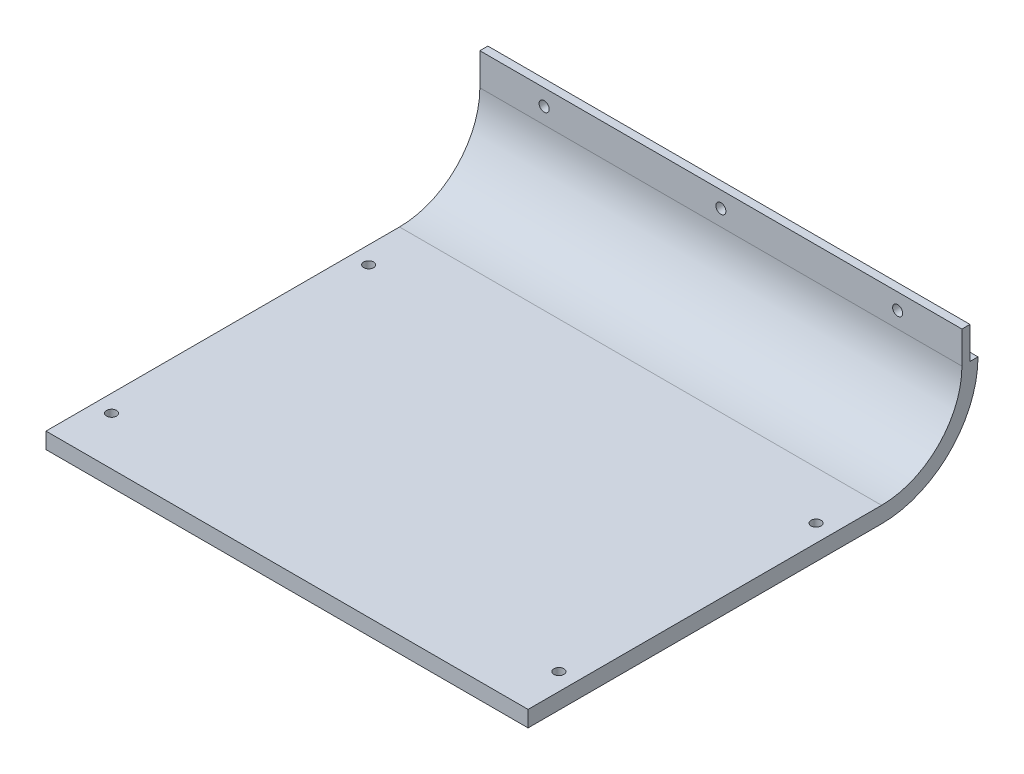
ISO-10303-21;
HEADER;
FILE_DESCRIPTION(('STEP AP214'),'2;1');
FILE_NAME('part.step','',(''),(''),'','','');
FILE_SCHEMA(('AUTOMOTIVE_DESIGN { 1 0 10303 214 1 1 1 1 }'));
ENDSEC;
DATA;
#1=APPLICATION_CONTEXT('core data for automotive mechanical design processes');
#2=APPLICATION_PROTOCOL_DEFINITION('international standard','automotive_design',2000,#1);
#3=PRODUCT_CONTEXT('',#1,'mechanical');
#4=PRODUCT('Part','Part','',(#3));
#5=PRODUCT_RELATED_PRODUCT_CATEGORY('part','',(#4));
#6=PRODUCT_DEFINITION_FORMATION('','',#4);
#7=PRODUCT_DEFINITION_CONTEXT('part definition',#1,'design');
#8=PRODUCT_DEFINITION('design','',#6,#7);
#9=PRODUCT_DEFINITION_SHAPE('','',#8);
#10=(LENGTH_UNIT() NAMED_UNIT(*) SI_UNIT(.MILLI.,.METRE.));
#11=(NAMED_UNIT(*) PLANE_ANGLE_UNIT() SI_UNIT($,.RADIAN.));
#12=(NAMED_UNIT(*) SI_UNIT($,.STERADIAN.) SOLID_ANGLE_UNIT());
#13=UNCERTAINTY_MEASURE_WITH_UNIT(LENGTH_MEASURE(1.E-05),#10,'distance_accuracy_value','');
#14=(GEOMETRIC_REPRESENTATION_CONTEXT(3) GLOBAL_UNCERTAINTY_ASSIGNED_CONTEXT((#13)) GLOBAL_UNIT_ASSIGNED_CONTEXT((#10,
#11,#12)) REPRESENTATION_CONTEXT('',''));
#15=CARTESIAN_POINT('',(0.,0.,0.));
#16=DIRECTION('',(0.,0.,1.));
#17=DIRECTION('',(1.,0.,0.));
#18=AXIS2_PLACEMENT_3D('',#15,#16,#17);
#19=CARTESIAN_POINT('',(-190.5,76.2,-139.7));
#20=DIRECTION('',(1.,0.,0.));
#21=DIRECTION('',(0.,0.,-1.));
#22=AXIS2_PLACEMENT_3D('',#19,#20,#21);
#23=CYLINDRICAL_SURFACE('',#22,76.2);
#24=DIRECTION('',(1.,0.,0.));
#25=VECTOR('',#24,1.);
#26=CARTESIAN_POINT('',(-190.5,76.2,-215.9));
#27=LINE('',#26,#25);
#28=CARTESIAN_POINT('',(-190.5,76.2,-215.9));
#29=VERTEX_POINT('',#28);
#30=CARTESIAN_POINT('',(190.5,76.2,-215.9));
#31=VERTEX_POINT('',#30);
#32=EDGE_CURVE('E61',#29,#31,#27,.T.);
#33=ORIENTED_EDGE('',*,*,#32,.T.);
#34=CARTESIAN_POINT('',(190.5,76.2,-139.7));
#35=DIRECTION('',(1.,0.,0.));
#36=DIRECTION('',(0.,0.,1.));
#37=AXIS2_PLACEMENT_3D('',#34,#35,#36);
#38=CIRCLE('',#37,76.2);
#39=CARTESIAN_POINT('',(190.5,0.,-139.7));
#40=VERTEX_POINT('',#39);
#41=EDGE_CURVE('E160',#40,#31,#38,.T.);
#42=ORIENTED_EDGE('',*,*,#41,.F.);
#43=DIRECTION('',(1.,0.,0.));
#44=VECTOR('',#43,1.);
#45=CARTESIAN_POINT('',(-190.5,0.,-139.7));
#46=LINE('',#45,#44);
#47=CARTESIAN_POINT('',(-190.5,0.,-139.7));
#48=VERTEX_POINT('',#47);
#49=EDGE_CURVE('E13',#48,#40,#46,.T.);
#50=ORIENTED_EDGE('',*,*,#49,.F.);
#51=CARTESIAN_POINT('',(-190.5,76.2,-139.7));
#52=DIRECTION('',(1.,0.,0.));
#53=DIRECTION('',(0.,0.,1.));
#54=AXIS2_PLACEMENT_3D('',#51,#52,#53);
#55=CIRCLE('',#54,76.2);
#56=EDGE_CURVE('E190',#48,#29,#55,.T.);
#57=ORIENTED_EDGE('',*,*,#56,.T.);
#58=EDGE_LOOP('',(#33,#42,#50,#57));
#59=FACE_BOUND('',#58,.T.);
#60=ADVANCED_FACE('F58',(#59),#23,.T.);
#61=CARTESIAN_POINT('',(-190.5,0.,139.7));
#62=DIRECTION('',(0.,-1.,0.));
#63=DIRECTION('',(0.,0.,-1.));
#64=AXIS2_PLACEMENT_3D('',#61,#62,#63);
#65=PLANE('',#64);
#66=CARTESIAN_POINT('',(176.784,0.,-101.6));
#67=DIRECTION('',(0.,1.,0.));
#68=DIRECTION('',(0.,0.,1.));
#69=AXIS2_PLACEMENT_3D('',#66,#67,#68);
#70=CIRCLE('',#69,3.937);
#71=CARTESIAN_POINT('',(176.784,0.,-97.6630000000001));
#72=VERTEX_POINT('',#71);
#73=EDGE_CURVE('E297',#72,#72,#70,.T.);
#74=ORIENTED_EDGE('',*,*,#73,.T.);
#75=EDGE_LOOP('',(#74));
#76=FACE_BOUND('',#75,.T.);
#77=CARTESIAN_POINT('',(-176.784,0.,101.6));
#78=DIRECTION('',(0.,1.,0.));
#79=DIRECTION('',(0.,0.,-1.));
#80=AXIS2_PLACEMENT_3D('',#77,#78,#79);
#81=CIRCLE('',#80,3.937);
#82=CARTESIAN_POINT('',(-176.784,0.,97.663));
#83=VERTEX_POINT('',#82);
#84=EDGE_CURVE('E288',#83,#83,#81,.T.);
#85=ORIENTED_EDGE('',*,*,#84,.T.);
#86=EDGE_LOOP('',(#85));
#87=FACE_BOUND('',#86,.T.);
#88=CARTESIAN_POINT('',(-176.784,0.,-101.6));
#89=DIRECTION('',(0.,1.,0.));
#90=DIRECTION('',(0.,0.,-1.));
#91=AXIS2_PLACEMENT_3D('',#88,#89,#90);
#92=CIRCLE('',#91,3.937);
#93=CARTESIAN_POINT('',(-176.784,0.,-105.537));
#94=VERTEX_POINT('',#93);
#95=EDGE_CURVE('E304',#94,#94,#92,.T.);
#96=ORIENTED_EDGE('',*,*,#95,.T.);
#97=EDGE_LOOP('',(#96));
#98=FACE_BOUND('',#97,.T.);
#99=CARTESIAN_POINT('',(176.784,0.,101.6));
#100=DIRECTION('',(0.,1.,0.));
#101=DIRECTION('',(0.,0.,1.));
#102=AXIS2_PLACEMENT_3D('',#99,#100,#101);
#103=CIRCLE('',#102,3.937);
#104=CARTESIAN_POINT('',(176.784,0.,105.537));
#105=VERTEX_POINT('',#104);
#106=EDGE_CURVE('E273',#105,#105,#103,.T.);
#107=ORIENTED_EDGE('',*,*,#106,.T.);
#108=EDGE_LOOP('',(#107));
#109=FACE_BOUND('',#108,.T.);
#110=ORIENTED_EDGE('',*,*,#49,.T.);
#111=DIRECTION('',(0.,0.,-1.));
#112=VECTOR('',#111,1.);
#113=CARTESIAN_POINT('',(190.5,0.,139.7));
#114=LINE('',#113,#112);
#115=CARTESIAN_POINT('',(190.5,0.,139.7));
#116=VERTEX_POINT('',#115);
#117=EDGE_CURVE('E186',#116,#40,#114,.T.);
#118=ORIENTED_EDGE('',*,*,#117,.F.);
#119=DIRECTION('',(1.,0.,0.));
#120=VECTOR('',#119,1.);
#121=CARTESIAN_POINT('',(-190.5,0.,139.7));
#122=LINE('',#121,#120);
#123=CARTESIAN_POINT('',(-190.5,0.,139.7));
#124=VERTEX_POINT('',#123);
#125=EDGE_CURVE('E67',#124,#116,#122,.T.);
#126=ORIENTED_EDGE('',*,*,#125,.F.);
#127=DIRECTION('',(0.,0.,-1.));
#128=VECTOR('',#127,1.);
#129=CARTESIAN_POINT('',(-190.5,0.,139.7));
#130=LINE('',#129,#128);
#131=EDGE_CURVE('E206',#124,#48,#130,.T.);
#132=ORIENTED_EDGE('',*,*,#131,.T.);
#133=EDGE_LOOP('',(#110,#118,#126,#132));
#134=FACE_BOUND('',#133,.T.);
#135=ADVANCED_FACE('F231',(#76,#87,#98,#109,#134),#65,.T.);
#136=CARTESIAN_POINT('',(-190.5,0.,139.7));
#137=DIRECTION('',(0.,0.,1.));
#138=DIRECTION('',(1.,0.,0.));
#139=AXIS2_PLACEMENT_3D('',#136,#137,#138);
#140=PLANE('',#139);
#141=ORIENTED_EDGE('',*,*,#125,.T.);
#142=DIRECTION('',(0.,-1.,0.));
#143=VECTOR('',#142,1.);
#144=CARTESIAN_POINT('',(190.5,0.,139.7));
#145=LINE('',#144,#143);
#146=CARTESIAN_POINT('',(190.5,12.7,139.7));
#147=VERTEX_POINT('',#146);
#148=EDGE_CURVE('E182',#147,#116,#145,.T.);
#149=ORIENTED_EDGE('',*,*,#148,.F.);
#150=DIRECTION('',(1.,0.,0.));
#151=VECTOR('',#150,1.);
#152=CARTESIAN_POINT('',(-190.5,12.7,139.7));
#153=LINE('',#152,#151);
#154=CARTESIAN_POINT('',(-190.5,12.7,139.7));
#155=VERTEX_POINT('',#154);
#156=EDGE_CURVE('E212',#155,#147,#153,.T.);
#157=ORIENTED_EDGE('',*,*,#156,.F.);
#158=DIRECTION('',(0.,-1.,0.));
#159=VECTOR('',#158,1.);
#160=CARTESIAN_POINT('',(-190.5,0.,139.7));
#161=LINE('',#160,#159);
#162=EDGE_CURVE('E202',#155,#124,#161,.T.);
#163=ORIENTED_EDGE('',*,*,#162,.T.);
#164=EDGE_LOOP('',(#141,#149,#157,#163));
#165=FACE_BOUND('',#164,.T.);
#166=ADVANCED_FACE('F319',(#165),#140,.T.);
#167=CARTESIAN_POINT('',(-190.5,12.7,139.7));
#168=DIRECTION('',(0.,1.,0.));
#169=DIRECTION('',(0.,0.,1.));
#170=AXIS2_PLACEMENT_3D('',#167,#168,#169);
#171=PLANE('',#170);
#172=CARTESIAN_POINT('',(176.784,12.7,-101.6));
#173=DIRECTION('',(0.,1.,0.));
#174=DIRECTION('',(0.,0.,1.));
#175=AXIS2_PLACEMENT_3D('',#172,#173,#174);
#176=CIRCLE('',#175,3.937);
#177=CARTESIAN_POINT('',(176.784,12.7,-97.6630000000001));
#178=VERTEX_POINT('',#177);
#179=EDGE_CURVE('E284',#178,#178,#176,.T.);
#180=ORIENTED_EDGE('',*,*,#179,.F.);
#181=EDGE_LOOP('',(#180));
#182=FACE_BOUND('',#181,.T.);
#183=CARTESIAN_POINT('',(-176.784,12.7,101.6));
#184=DIRECTION('',(0.,1.,0.));
#185=DIRECTION('',(0.,0.,-1.));
#186=AXIS2_PLACEMENT_3D('',#183,#184,#185);
#187=CIRCLE('',#186,3.937);
#188=CARTESIAN_POINT('',(-176.784,12.7,97.663));
#189=VERTEX_POINT('',#188);
#190=EDGE_CURVE('E292',#189,#189,#187,.T.);
#191=ORIENTED_EDGE('',*,*,#190,.F.);
#192=EDGE_LOOP('',(#191));
#193=FACE_BOUND('',#192,.T.);
#194=CARTESIAN_POINT('',(-176.784,12.7,-101.6));
#195=DIRECTION('',(0.,1.,0.));
#196=DIRECTION('',(0.,0.,-1.));
#197=AXIS2_PLACEMENT_3D('',#194,#195,#196);
#198=CIRCLE('',#197,3.937);
#199=CARTESIAN_POINT('',(-176.784,12.7,-105.537));
#200=VERTEX_POINT('',#199);
#201=EDGE_CURVE('E293',#200,#200,#198,.T.);
#202=ORIENTED_EDGE('',*,*,#201,.F.);
#203=EDGE_LOOP('',(#202));
#204=FACE_BOUND('',#203,.T.);
#205=CARTESIAN_POINT('',(176.784,12.7,101.6));
#206=DIRECTION('',(0.,1.,0.));
#207=DIRECTION('',(0.,0.,1.));
#208=AXIS2_PLACEMENT_3D('',#205,#206,#207);
#209=CIRCLE('',#208,3.937);
#210=CARTESIAN_POINT('',(176.784,12.7,105.537));
#211=VERTEX_POINT('',#210);
#212=EDGE_CURVE('E280',#211,#211,#209,.T.);
#213=ORIENTED_EDGE('',*,*,#212,.F.);
#214=EDGE_LOOP('',(#213));
#215=FACE_BOUND('',#214,.T.);
#216=ORIENTED_EDGE('',*,*,#156,.T.);
#217=DIRECTION('',(0.,0.,1.));
#218=VECTOR('',#217,1.);
#219=CARTESIAN_POINT('',(190.5,12.7,139.7));
#220=LINE('',#219,#218);
#221=CARTESIAN_POINT('',(190.5,12.7,-139.7));
#222=VERTEX_POINT('',#221);
#223=EDGE_CURVE('E178',#222,#147,#220,.T.);
#224=ORIENTED_EDGE('',*,*,#223,.F.);
#225=DIRECTION('',(1.,0.,0.));
#226=VECTOR('',#225,1.);
#227=CARTESIAN_POINT('',(-190.5,12.7,-139.7));
#228=LINE('',#227,#226);
#229=CARTESIAN_POINT('',(-190.5,12.7,-139.7));
#230=VERTEX_POINT('',#229);
#231=EDGE_CURVE('E215',#230,#222,#228,.T.);
#232=ORIENTED_EDGE('',*,*,#231,.F.);
#233=DIRECTION('',(0.,0.,1.));
#234=VECTOR('',#233,1.);
#235=CARTESIAN_POINT('',(-190.5,12.7,139.7));
#236=LINE('',#235,#234);
#237=EDGE_CURVE('E198',#230,#155,#236,.T.);
#238=ORIENTED_EDGE('',*,*,#237,.T.);
#239=EDGE_LOOP('',(#216,#224,#232,#238));
#240=FACE_BOUND('',#239,.T.);
#241=ADVANCED_FACE('F315',(#182,#193,#204,#215,#240),#171,.T.);
#242=CARTESIAN_POINT('',(-190.5,76.2,-139.7));
#243=DIRECTION('',(1.,0.,0.));
#244=DIRECTION('',(0.,0.,-1.));
#245=AXIS2_PLACEMENT_3D('',#242,#243,#244);
#246=CYLINDRICAL_SURFACE('',#245,63.5);
#247=ORIENTED_EDGE('',*,*,#231,.T.);
#248=CARTESIAN_POINT('',(190.5,76.2,-139.7));
#249=DIRECTION('',(-1.,0.,0.));
#250=DIRECTION('',(0.,0.,1.));
#251=AXIS2_PLACEMENT_3D('',#248,#249,#250);
#252=CIRCLE('',#251,63.5);
#253=CARTESIAN_POINT('',(190.5,76.2,-203.2));
#254=VERTEX_POINT('',#253);
#255=EDGE_CURVE('E174',#254,#222,#252,.T.);
#256=ORIENTED_EDGE('',*,*,#255,.F.);
#257=DIRECTION('',(1.,0.,0.));
#258=VECTOR('',#257,1.);
#259=CARTESIAN_POINT('',(-190.5,76.2,-203.2));
#260=LINE('',#259,#258);
#261=CARTESIAN_POINT('',(-190.5,76.2,-203.2));
#262=VERTEX_POINT('',#261);
#263=EDGE_CURVE('E217',#262,#254,#260,.T.);
#264=ORIENTED_EDGE('',*,*,#263,.F.);
#265=CARTESIAN_POINT('',(-190.5,76.2,-139.7));
#266=DIRECTION('',(-1.,0.,0.));
#267=DIRECTION('',(0.,0.,1.));
#268=AXIS2_PLACEMENT_3D('',#265,#266,#267);
#269=CIRCLE('',#268,63.5);
#270=EDGE_CURVE('E158',#262,#230,#269,.T.);
#271=ORIENTED_EDGE('',*,*,#270,.T.);
#272=EDGE_LOOP('',(#247,#256,#264,#271));
#273=FACE_BOUND('',#272,.T.);
#274=ADVANCED_FACE('F318',(#273),#246,.F.);
#275=CARTESIAN_POINT('',(-190.5,76.2,-203.2));
#276=DIRECTION('',(0.,1.,0.));
#277=DIRECTION('',(0.,0.,1.));
#278=AXIS2_PLACEMENT_3D('',#275,#276,#277);
#279=PLANE('',#278);
#280=DIRECTION('',(-1.,0.,0.));
#281=VECTOR('',#280,1.);
#282=CARTESIAN_POINT('',(-190.5,76.2,-209.55));
#283=LINE('',#282,#281);
#284=CARTESIAN_POINT('',(190.5,76.2,-209.55));
#285=VERTEX_POINT('',#284);
#286=CARTESIAN_POINT('',(-190.5,76.2,-209.55));
#287=VERTEX_POINT('',#286);
#288=EDGE_CURVE('E75',#285,#287,#283,.T.);
#289=ORIENTED_EDGE('',*,*,#288,.F.);
#290=DIRECTION('',(0.,0.,1.));
#291=VECTOR('',#290,1.);
#292=CARTESIAN_POINT('',(190.5,76.2,-203.2));
#293=LINE('',#292,#291);
#294=EDGE_CURVE('E166',#31,#285,#293,.T.);
#295=ORIENTED_EDGE('',*,*,#294,.F.);
#296=ORIENTED_EDGE('',*,*,#32,.F.);
#297=DIRECTION('',(0.,0.,1.));
#298=VECTOR('',#297,1.);
#299=CARTESIAN_POINT('',(-190.5,76.2,-203.2));
#300=LINE('',#299,#298);
#301=EDGE_CURVE('E193',#29,#287,#300,.T.);
#302=ORIENTED_EDGE('',*,*,#301,.T.);
#303=EDGE_LOOP('',(#289,#295,#296,#302));
#304=FACE_BOUND('',#303,.T.);
#305=ADVANCED_FACE('F223',(#304),#279,.T.);
#306=CARTESIAN_POINT('',(-190.5,76.2,-139.7));
#307=DIRECTION('',(-1.,0.,0.));
#308=DIRECTION('',(0.,0.,1.));
#309=AXIS2_PLACEMENT_3D('',#306,#307,#308);
#310=PLANE('',#309);
#311=ORIENTED_EDGE('',*,*,#56,.F.);
#312=ORIENTED_EDGE('',*,*,#131,.F.);
#313=ORIENTED_EDGE('',*,*,#162,.F.);
#314=ORIENTED_EDGE('',*,*,#237,.F.);
#315=ORIENTED_EDGE('',*,*,#270,.F.);
#316=DIRECTION('',(0.,-1.,0.));
#317=VECTOR('',#316,1.);
#318=CARTESIAN_POINT('',(-190.5,101.6,-203.2));
#319=LINE('',#318,#317);
#320=CARTESIAN_POINT('',(-190.5,101.6,-203.2));
#321=VERTEX_POINT('',#320);
#322=EDGE_CURVE('E136',#321,#262,#319,.T.);
#323=ORIENTED_EDGE('',*,*,#322,.F.);
#324=DIRECTION('',(0.,0.,1.));
#325=VECTOR('',#324,1.);
#326=CARTESIAN_POINT('',(-190.5,101.6,-209.55));
#327=LINE('',#326,#325);
#328=CARTESIAN_POINT('',(-190.5,101.6,-209.55));
#329=VERTEX_POINT('',#328);
#330=EDGE_CURVE('E143',#329,#321,#327,.T.);
#331=ORIENTED_EDGE('',*,*,#330,.F.);
#332=DIRECTION('',(0.,-1.,0.));
#333=VECTOR('',#332,1.);
#334=CARTESIAN_POINT('',(-190.5,101.6,-209.55));
#335=LINE('',#334,#333);
#336=EDGE_CURVE('E234',#329,#287,#335,.T.);
#337=ORIENTED_EDGE('',*,*,#336,.T.);
#338=ORIENTED_EDGE('',*,*,#301,.F.);
#339=EDGE_LOOP('',(#311,#312,#313,#314,#315,#323,#331,#337,#338));
#340=FACE_BOUND('',#339,.T.);
#341=ADVANCED_FACE('F155',(#340),#310,.T.);
#342=CARTESIAN_POINT('',(190.5,76.2,-139.7));
#343=DIRECTION('',(-1.,0.,0.));
#344=DIRECTION('',(0.,0.,1.));
#345=AXIS2_PLACEMENT_3D('',#342,#343,#344);
#346=PLANE('',#345);
#347=ORIENTED_EDGE('',*,*,#41,.T.);
#348=ORIENTED_EDGE('',*,*,#294,.T.);
#349=DIRECTION('',(0.,-1.,0.));
#350=VECTOR('',#349,1.);
#351=CARTESIAN_POINT('',(190.5,101.6,-209.55));
#352=LINE('',#351,#350);
#353=CARTESIAN_POINT('',(190.5,101.6,-209.55));
#354=VERTEX_POINT('',#353);
#355=EDGE_CURVE('E168',#354,#285,#352,.T.);
#356=ORIENTED_EDGE('',*,*,#355,.F.);
#357=DIRECTION('',(0.,0.,-1.));
#358=VECTOR('',#357,1.);
#359=CARTESIAN_POINT('',(190.5,101.6,-209.55));
#360=LINE('',#359,#358);
#361=CARTESIAN_POINT('',(190.5,101.6,-203.2));
#362=VERTEX_POINT('',#361);
#363=EDGE_CURVE('E142',#362,#354,#360,.T.);
#364=ORIENTED_EDGE('',*,*,#363,.F.);
#365=DIRECTION('',(0.,-1.,0.));
#366=VECTOR('',#365,1.);
#367=CARTESIAN_POINT('',(190.5,101.6,-203.2));
#368=LINE('',#367,#366);
#369=EDGE_CURVE('E138',#362,#254,#368,.T.);
#370=ORIENTED_EDGE('',*,*,#369,.T.);
#371=ORIENTED_EDGE('',*,*,#255,.T.);
#372=ORIENTED_EDGE('',*,*,#223,.T.);
#373=ORIENTED_EDGE('',*,*,#148,.T.);
#374=ORIENTED_EDGE('',*,*,#117,.T.);
#375=EDGE_LOOP('',(#347,#348,#356,#364,#370,#371,#372,#373,#374));
#376=FACE_BOUND('',#375,.T.);
#377=ADVANCED_FACE('F227',(#376),#346,.F.);
#378=CARTESIAN_POINT('',(-190.5,101.6,-203.2));
#379=DIRECTION('',(0.,0.,-1.));
#380=DIRECTION('',(-1.,0.,0.));
#381=AXIS2_PLACEMENT_3D('',#378,#379,#380);
#382=PLANE('',#381);
#383=CARTESIAN_POINT('',(139.7,88.9,-203.2));
#384=DIRECTION('',(0.,0.,-1.));
#385=DIRECTION('',(-1.,0.,0.));
#386=AXIS2_PLACEMENT_3D('',#383,#384,#385);
#387=CIRCLE('',#386,3.96874999999999);
#388=CARTESIAN_POINT('',(135.73125,88.9,-203.2));
#389=VERTEX_POINT('',#388);
#390=EDGE_CURVE('E238',#389,#389,#387,.T.);
#391=ORIENTED_EDGE('',*,*,#390,.T.);
#392=EDGE_LOOP('',(#391));
#393=FACE_BOUND('',#392,.T.);
#394=CARTESIAN_POINT('',(-139.7,88.9,-203.2));
#395=DIRECTION('',(0.,0.,-1.));
#396=DIRECTION('',(-1.,0.,0.));
#397=AXIS2_PLACEMENT_3D('',#394,#395,#396);
#398=CIRCLE('',#397,3.96874999999999);
#399=CARTESIAN_POINT('',(-143.66875,88.9,-203.2));
#400=VERTEX_POINT('',#399);
#401=EDGE_CURVE('E243',#400,#400,#398,.T.);
#402=ORIENTED_EDGE('',*,*,#401,.T.);
#403=EDGE_LOOP('',(#402));
#404=FACE_BOUND('',#403,.T.);
#405=CARTESIAN_POINT('',(0.,88.9,-203.2));
#406=DIRECTION('',(0.,0.,-1.));
#407=DIRECTION('',(-1.,0.,0.));
#408=AXIS2_PLACEMENT_3D('',#405,#406,#407);
#409=CIRCLE('',#408,3.96875);
#410=CARTESIAN_POINT('',(-3.96875,88.9,-203.2));
#411=VERTEX_POINT('',#410);
#412=EDGE_CURVE('E263',#411,#411,#409,.T.);
#413=ORIENTED_EDGE('',*,*,#412,.T.);
#414=EDGE_LOOP('',(#413));
#415=FACE_BOUND('',#414,.T.);
#416=ORIENTED_EDGE('',*,*,#263,.T.);
#417=ORIENTED_EDGE('',*,*,#369,.F.);
#418=DIRECTION('',(1.,0.,0.));
#419=VECTOR('',#418,1.);
#420=CARTESIAN_POINT('',(-190.5,101.6,-203.2));
#421=LINE('',#420,#419);
#422=EDGE_CURVE('E131',#321,#362,#421,.T.);
#423=ORIENTED_EDGE('',*,*,#422,.F.);
#424=ORIENTED_EDGE('',*,*,#322,.T.);
#425=EDGE_LOOP('',(#416,#417,#423,#424));
#426=FACE_BOUND('',#425,.T.);
#427=ADVANCED_FACE('F134',(#393,#404,#415,#426),#382,.F.);
#428=CARTESIAN_POINT('',(-190.5,101.6,-209.55));
#429=DIRECTION('',(0.,0.,1.));
#430=DIRECTION('',(1.,0.,0.));
#431=AXIS2_PLACEMENT_3D('',#428,#429,#430);
#432=PLANE('',#431);
#433=CARTESIAN_POINT('',(139.7,88.9,-209.55));
#434=DIRECTION('',(0.,0.,-1.));
#435=DIRECTION('',(-1.,0.,0.));
#436=AXIS2_PLACEMENT_3D('',#433,#434,#435);
#437=CIRCLE('',#436,3.96874999999999);
#438=CARTESIAN_POINT('',(135.73125,88.9,-209.55));
#439=VERTEX_POINT('',#438);
#440=EDGE_CURVE('E267',#439,#439,#437,.T.);
#441=ORIENTED_EDGE('',*,*,#440,.F.);
#442=EDGE_LOOP('',(#441));
#443=FACE_BOUND('',#442,.T.);
#444=CARTESIAN_POINT('',(-139.7,88.9,-209.55));
#445=DIRECTION('',(0.,0.,-1.));
#446=DIRECTION('',(-1.,0.,0.));
#447=AXIS2_PLACEMENT_3D('',#444,#445,#446);
#448=CIRCLE('',#447,3.96874999999999);
#449=CARTESIAN_POINT('',(-143.66875,88.9,-209.55));
#450=VERTEX_POINT('',#449);
#451=EDGE_CURVE('E272',#450,#450,#448,.T.);
#452=ORIENTED_EDGE('',*,*,#451,.F.);
#453=EDGE_LOOP('',(#452));
#454=FACE_BOUND('',#453,.T.);
#455=CARTESIAN_POINT('',(0.,88.9,-209.55));
#456=DIRECTION('',(0.,0.,-1.));
#457=DIRECTION('',(-1.,0.,0.));
#458=AXIS2_PLACEMENT_3D('',#455,#456,#457);
#459=CIRCLE('',#458,3.96875);
#460=CARTESIAN_POINT('',(-3.96875,88.9,-209.55));
#461=VERTEX_POINT('',#460);
#462=EDGE_CURVE('E268',#461,#461,#459,.T.);
#463=ORIENTED_EDGE('',*,*,#462,.F.);
#464=EDGE_LOOP('',(#463));
#465=FACE_BOUND('',#464,.T.);
#466=ORIENTED_EDGE('',*,*,#288,.T.);
#467=ORIENTED_EDGE('',*,*,#336,.F.);
#468=DIRECTION('',(-1.,0.,0.));
#469=VECTOR('',#468,1.);
#470=CARTESIAN_POINT('',(-190.5,101.6,-209.55));
#471=LINE('',#470,#469);
#472=EDGE_CURVE('E148',#354,#329,#471,.T.);
#473=ORIENTED_EDGE('',*,*,#472,.F.);
#474=ORIENTED_EDGE('',*,*,#355,.T.);
#475=EDGE_LOOP('',(#466,#467,#473,#474));
#476=FACE_BOUND('',#475,.T.);
#477=ADVANCED_FACE('F236',(#443,#454,#465,#476),#432,.F.);
#478=CARTESIAN_POINT('',(0.,101.6,0.));
#479=DIRECTION('',(0.,1.,0.));
#480=DIRECTION('',(0.,0.,1.));
#481=AXIS2_PLACEMENT_3D('',#478,#479,#480);
#482=PLANE('',#481);
#483=ORIENTED_EDGE('',*,*,#330,.T.);
#484=ORIENTED_EDGE('',*,*,#422,.T.);
#485=ORIENTED_EDGE('',*,*,#363,.T.);
#486=ORIENTED_EDGE('',*,*,#472,.T.);
#487=EDGE_LOOP('',(#483,#484,#485,#486));
#488=FACE_BOUND('',#487,.T.);
#489=ADVANCED_FACE('F146',(#488),#482,.T.);
#490=CARTESIAN_POINT('',(0.,88.9,-184.15));
#491=DIRECTION('',(0.,0.,-1.));
#492=DIRECTION('',(-1.,0.,0.));
#493=AXIS2_PLACEMENT_3D('',#490,#491,#492);
#494=CYLINDRICAL_SURFACE('',#493,3.96875);
#495=ORIENTED_EDGE('',*,*,#462,.T.);
#496=EDGE_LOOP('',(#495));
#497=FACE_BOUND('',#496,.T.);
#498=ORIENTED_EDGE('',*,*,#412,.F.);
#499=EDGE_LOOP('',(#498));
#500=FACE_BOUND('',#499,.T.);
#501=ADVANCED_FACE('F420',(#497,#500),#494,.F.);
#502=CARTESIAN_POINT('',(-139.7,88.9,-184.15));
#503=DIRECTION('',(0.,0.,-1.));
#504=DIRECTION('',(-1.,0.,0.));
#505=AXIS2_PLACEMENT_3D('',#502,#503,#504);
#506=CYLINDRICAL_SURFACE('',#505,3.96874999999999);
#507=ORIENTED_EDGE('',*,*,#451,.T.);
#508=EDGE_LOOP('',(#507));
#509=FACE_BOUND('',#508,.T.);
#510=ORIENTED_EDGE('',*,*,#401,.F.);
#511=EDGE_LOOP('',(#510));
#512=FACE_BOUND('',#511,.T.);
#513=ADVANCED_FACE('F428',(#509,#512),#506,.F.);
#514=CARTESIAN_POINT('',(139.7,88.9,-184.15));
#515=DIRECTION('',(0.,0.,-1.));
#516=DIRECTION('',(-1.,0.,0.));
#517=AXIS2_PLACEMENT_3D('',#514,#515,#516);
#518=CYLINDRICAL_SURFACE('',#517,3.96874999999999);
#519=ORIENTED_EDGE('',*,*,#440,.T.);
#520=EDGE_LOOP('',(#519));
#521=FACE_BOUND('',#520,.T.);
#522=ORIENTED_EDGE('',*,*,#390,.F.);
#523=EDGE_LOOP('',(#522));
#524=FACE_BOUND('',#523,.T.);
#525=ADVANCED_FACE('F438',(#521,#524),#518,.F.);
#526=CARTESIAN_POINT('',(176.784,0.,101.6));
#527=DIRECTION('',(0.,1.,0.));
#528=DIRECTION('',(0.,0.,1.));
#529=AXIS2_PLACEMENT_3D('',#526,#527,#528);
#530=CYLINDRICAL_SURFACE('',#529,3.937);
#531=ORIENTED_EDGE('',*,*,#106,.F.);
#532=EDGE_LOOP('',(#531));
#533=FACE_BOUND('',#532,.T.);
#534=ORIENTED_EDGE('',*,*,#212,.T.);
#535=EDGE_LOOP('',(#534));
#536=FACE_BOUND('',#535,.T.);
#537=ADVANCED_FACE('F447',(#533,#536),#530,.F.);
#538=CARTESIAN_POINT('',(-176.784,0.,-101.6));
#539=DIRECTION('',(0.,1.,0.));
#540=DIRECTION('',(0.,0.,1.));
#541=AXIS2_PLACEMENT_3D('',#538,#539,#540);
#542=CYLINDRICAL_SURFACE('',#541,3.937);
#543=ORIENTED_EDGE('',*,*,#95,.F.);
#544=EDGE_LOOP('',(#543));
#545=FACE_BOUND('',#544,.T.);
#546=ORIENTED_EDGE('',*,*,#201,.T.);
#547=EDGE_LOOP('',(#546));
#548=FACE_BOUND('',#547,.T.);
#549=ADVANCED_FACE('F313',(#545,#548),#542,.F.);
#550=CARTESIAN_POINT('',(-176.784,0.,101.6));
#551=DIRECTION('',(0.,1.,0.));
#552=DIRECTION('',(0.,0.,1.));
#553=AXIS2_PLACEMENT_3D('',#550,#551,#552);
#554=CYLINDRICAL_SURFACE('',#553,3.937);
#555=ORIENTED_EDGE('',*,*,#84,.F.);
#556=EDGE_LOOP('',(#555));
#557=FACE_BOUND('',#556,.T.);
#558=ORIENTED_EDGE('',*,*,#190,.T.);
#559=EDGE_LOOP('',(#558));
#560=FACE_BOUND('',#559,.T.);
#561=ADVANCED_FACE('F465',(#557,#560),#554,.F.);
#562=CARTESIAN_POINT('',(176.784,0.,-101.6));
#563=DIRECTION('',(0.,1.,0.));
#564=DIRECTION('',(0.,0.,1.));
#565=AXIS2_PLACEMENT_3D('',#562,#563,#564);
#566=CYLINDRICAL_SURFACE('',#565,3.937);
#567=ORIENTED_EDGE('',*,*,#73,.F.);
#568=EDGE_LOOP('',(#567));
#569=FACE_BOUND('',#568,.T.);
#570=ORIENTED_EDGE('',*,*,#179,.T.);
#571=EDGE_LOOP('',(#570));
#572=FACE_BOUND('',#571,.T.);
#573=ADVANCED_FACE('F475',(#569,#572),#566,.F.);
#574=CLOSED_SHELL('',(#60,#135,#166,#241,#274,#305,#341,#377,#427,#477,#489,#501,#513,#525,#537,
#549,#561,#573));
#575=MANIFOLD_SOLID_BREP('B2',#574);
#576=ADVANCED_BREP_SHAPE_REPRESENTATION('',(#18,#575),#14);
#577=SHAPE_DEFINITION_REPRESENTATION(#9,#576);
ENDSEC;
END-ISO-10303-21;
